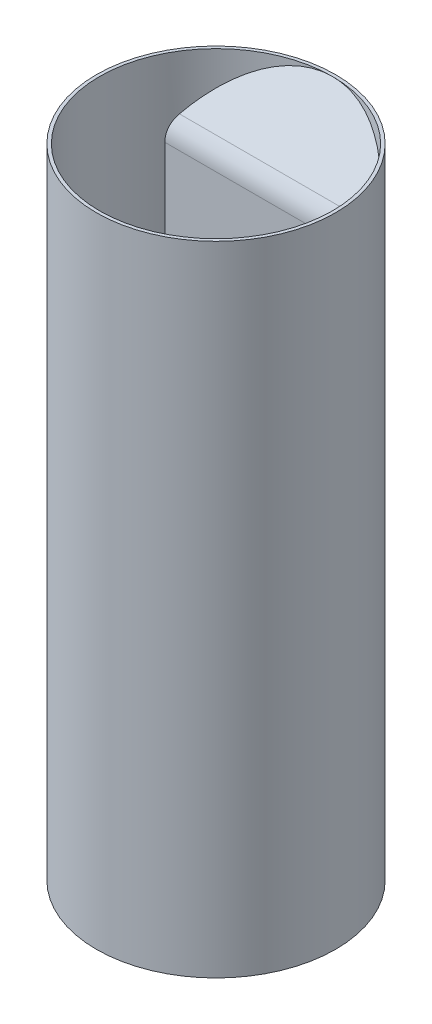
ISO-10303-21;
HEADER;
FILE_DESCRIPTION(('STEP AP214'),'2;1');
FILE_NAME('part.step','',(''),(''),'','','');
FILE_SCHEMA(('AUTOMOTIVE_DESIGN { 1 0 10303 214 1 1 1 1 }'));
ENDSEC;
DATA;
#1=APPLICATION_CONTEXT('core data for automotive mechanical design processes');
#2=APPLICATION_PROTOCOL_DEFINITION('international standard','automotive_design',2000,#1);
#3=PRODUCT_CONTEXT('',#1,'mechanical');
#4=PRODUCT('Part','Part','',(#3));
#5=PRODUCT_RELATED_PRODUCT_CATEGORY('part','',(#4));
#6=PRODUCT_DEFINITION_FORMATION('','',#4);
#7=PRODUCT_DEFINITION_CONTEXT('part definition',#1,'design');
#8=PRODUCT_DEFINITION('design','',#6,#7);
#9=PRODUCT_DEFINITION_SHAPE('','',#8);
#10=(LENGTH_UNIT() NAMED_UNIT(*) SI_UNIT(.MILLI.,.METRE.));
#11=(NAMED_UNIT(*) PLANE_ANGLE_UNIT() SI_UNIT($,.RADIAN.));
#12=(NAMED_UNIT(*) SI_UNIT($,.STERADIAN.) SOLID_ANGLE_UNIT());
#13=UNCERTAINTY_MEASURE_WITH_UNIT(LENGTH_MEASURE(1.E-05),#10,'distance_accuracy_value','');
#14=(GEOMETRIC_REPRESENTATION_CONTEXT(3) GLOBAL_UNCERTAINTY_ASSIGNED_CONTEXT((#13)) GLOBAL_UNIT_ASSIGNED_CONTEXT((#10,
#11,#12)) REPRESENTATION_CONTEXT('',''));
#15=CARTESIAN_POINT('',(0.,0.,0.));
#16=DIRECTION('',(0.,0.,1.));
#17=DIRECTION('',(1.,0.,0.));
#18=AXIS2_PLACEMENT_3D('',#15,#16,#17);
#19=CARTESIAN_POINT('',(0.,200.,0.));
#20=DIRECTION('',(0.,-1.,0.));
#21=DIRECTION('',(0.,0.,-1.));
#22=AXIS2_PLACEMENT_3D('',#19,#20,#21);
#23=CYLINDRICAL_SURFACE('',#22,37.5);
#24=CARTESIAN_POINT('',(0.,200.,0.));
#25=DIRECTION('',(0.,1.,0.));
#26=DIRECTION('',(0.,0.,1.));
#27=AXIS2_PLACEMENT_3D('',#24,#25,#26);
#28=CIRCLE('',#27,37.5);
#29=CARTESIAN_POINT('',(0.,200.,37.5));
#30=VERTEX_POINT('',#29);
#31=EDGE_CURVE('E124',#30,#30,#28,.T.);
#32=ORIENTED_EDGE('',*,*,#31,.F.);
#33=EDGE_LOOP('',(#32));
#34=FACE_BOUND('',#33,.T.);
#35=CARTESIAN_POINT('',(0.,0.,0.));
#36=DIRECTION('',(0.,1.,0.));
#37=DIRECTION('',(0.,0.,1.));
#38=AXIS2_PLACEMENT_3D('',#35,#36,#37);
#39=CIRCLE('',#38,37.5);
#40=CARTESIAN_POINT('',(0.,0.,37.5));
#41=VERTEX_POINT('',#40);
#42=EDGE_CURVE('E122',#41,#41,#39,.T.);
#43=ORIENTED_EDGE('',*,*,#42,.T.);
#44=EDGE_LOOP('',(#43));
#45=FACE_BOUND('',#44,.T.);
#46=ADVANCED_FACE('F50',(#34,#45),#23,.T.);
#47=CARTESIAN_POINT('',(0.,200.,0.));
#48=DIRECTION('',(0.,1.,0.));
#49=DIRECTION('',(0.,0.,1.));
#50=AXIS2_PLACEMENT_3D('',#47,#48,#49);
#51=PLANE('',#50);
#52=CARTESIAN_POINT('',(0.,200.,0.));
#53=DIRECTION('',(0.,1.,0.));
#54=DIRECTION('',(0.,0.,1.));
#55=AXIS2_PLACEMENT_3D('',#52,#53,#54);
#56=CIRCLE('',#55,36.5);
#57=CARTESIAN_POINT('',(0.,200.,-36.5));
#58=VERTEX_POINT('',#57);
#59=EDGE_CURVE('E117',#58,#58,#56,.T.);
#60=ORIENTED_EDGE('',*,*,#59,.F.);
#61=EDGE_LOOP('',(#60));
#62=FACE_BOUND('',#61,.T.);
#63=ORIENTED_EDGE('',*,*,#31,.T.);
#64=EDGE_LOOP('',(#63));
#65=FACE_BOUND('',#64,.T.);
#66=ADVANCED_FACE('F171',(#62,#65),#51,.T.);
#67=CARTESIAN_POINT('',(0.,0.,0.));
#68=DIRECTION('',(0.,1.,0.));
#69=DIRECTION('',(0.,0.,1.));
#70=AXIS2_PLACEMENT_3D('',#67,#68,#69);
#71=PLANE('',#70);
#72=CARTESIAN_POINT('',(0.,0.,0.));
#73=DIRECTION('',(0.,1.,0.));
#74=DIRECTION('',(0.,0.,1.));
#75=AXIS2_PLACEMENT_3D('',#72,#73,#74);
#76=CIRCLE('',#75,36.5);
#77=CARTESIAN_POINT('',(0.,0.,-36.5));
#78=VERTEX_POINT('',#77);
#79=EDGE_CURVE('E103',#78,#78,#76,.T.);
#80=ORIENTED_EDGE('',*,*,#79,.T.);
#81=EDGE_LOOP('',(#80));
#82=FACE_BOUND('',#81,.T.);
#83=ORIENTED_EDGE('',*,*,#42,.F.);
#84=EDGE_LOOP('',(#83));
#85=FACE_BOUND('',#84,.T.);
#86=ADVANCED_FACE('F114',(#82,#85),#71,.F.);
#87=CARTESIAN_POINT('',(0.,0.,-16.5));
#88=DIRECTION('',(0.,0.,-1.));
#89=DIRECTION('',(-1.,0.,0.));
#90=AXIS2_PLACEMENT_3D('',#87,#88,#89);
#91=PLANE('',#90);
#92=DIRECTION('',(0.,1.,0.));
#93=VECTOR('',#92,1.);
#94=CARTESIAN_POINT('',(-32.5576411921994,0.,-16.5));
#95=LINE('',#94,#93);
#96=CARTESIAN_POINT('',(-32.5576411921994,24.142135623731,-16.5));
#97=VERTEX_POINT('',#96);
#98=CARTESIAN_POINT('',(-32.5576411921994,175.857864376269,-16.5));
#99=VERTEX_POINT('',#98);
#100=EDGE_CURVE('E113',#97,#99,#95,.T.);
#101=ORIENTED_EDGE('',*,*,#100,.F.);
#102=DIRECTION('',(-1.,0.,0.));
#103=VECTOR('',#102,1.);
#104=CARTESIAN_POINT('',(32.5576411921994,24.142135623731,-16.5));
#105=LINE('',#104,#103);
#106=CARTESIAN_POINT('',(32.5576411921994,24.142135623731,-16.5));
#107=VERTEX_POINT('',#106);
#108=EDGE_CURVE('E140',#97,#107,#105,.F.);
#109=ORIENTED_EDGE('',*,*,#108,.T.);
#110=DIRECTION('',(0.,1.,0.));
#111=VECTOR('',#110,1.);
#112=CARTESIAN_POINT('',(32.5576411921994,0.,-16.5));
#113=LINE('',#112,#111);
#114=CARTESIAN_POINT('',(32.5576411921994,175.857864376269,-16.5));
#115=VERTEX_POINT('',#114);
#116=EDGE_CURVE('E118',#107,#115,#113,.T.);
#117=ORIENTED_EDGE('',*,*,#116,.T.);
#118=DIRECTION('',(-1.,0.,0.));
#119=VECTOR('',#118,1.);
#120=CARTESIAN_POINT('',(-32.5576411921994,175.857864376269,-16.5));
#121=LINE('',#120,#119);
#122=EDGE_CURVE('E134',#115,#99,#121,.T.);
#123=ORIENTED_EDGE('',*,*,#122,.T.);
#124=EDGE_LOOP('',(#101,#109,#117,#123));
#125=FACE_BOUND('',#124,.T.);
#126=ADVANCED_FACE('F178',(#125),#91,.F.);
#127=CARTESIAN_POINT('',(0.,0.,0.));
#128=DIRECTION('',(0.,1.,0.));
#129=DIRECTION('',(0.,0.,1.));
#130=AXIS2_PLACEMENT_3D('',#127,#128,#129);
#131=CYLINDRICAL_SURFACE('',#130,36.5);
#132=ORIENTED_EDGE('',*,*,#59,.T.);
#133=CARTESIAN_POINT('',(0.,163.5,0.));
#134=DIRECTION('',(0.,0.707106781186549,0.707106781186546));
#135=DIRECTION('',(0.,0.707106781186546,-0.707106781186549));
#136=AXIS2_PLACEMENT_3D('',#133,#134,#135);
#137=ELLIPSE('',#136,51.6187950266178,36.5);
#138=CARTESIAN_POINT('',(30.899297630025,182.928932188135,-19.4289321881345));
#139=VERTEX_POINT('',#138);
#140=EDGE_CURVE('E135',#58,#139,#137,.F.);
#141=ORIENTED_EDGE('',*,*,#140,.T.);
#142=CARTESIAN_POINT('',(30.899297630025,182.928932188135,-19.4289321881345));
#143=CARTESIAN_POINT('',(31.0075415299145,182.75685365177,-19.2568001959945));
#144=CARTESIAN_POINT('',(31.1107842388141,182.576830225323,-19.0893965583128));
#145=CARTESIAN_POINT('',(31.3070357989315,182.201626524123,-18.7657978255964));
#146=CARTESIAN_POINT('',(31.4000406640883,182.006440395933,-18.6096071044379));
#147=CARTESIAN_POINT('',(31.5756734478273,181.60138047178,-18.3100276776641));
#148=CARTESIAN_POINT('',(31.658280566387,181.39147850315,-18.1666647938027));
#149=CARTESIAN_POINT('',(31.8127167498647,180.958513494411,-17.894845154152));
#150=CARTESIAN_POINT('',(31.8845475675578,180.735452602854,-17.7663859750337));
#151=CARTESIAN_POINT('',(32.0175417261876,180.276812746571,-17.5255817254496));
#152=CARTESIAN_POINT('',(32.0786718426565,180.041197656195,-17.4132870291337));
#153=CARTESIAN_POINT('',(32.1899446642923,179.559699617599,-17.2067206587989));
#154=CARTESIAN_POINT('',(32.2400877822675,179.313817055567,-17.1124483076533));
#155=CARTESIAN_POINT('',(32.3292881257125,178.814109056346,-16.943324989152));
#156=CARTESIAN_POINT('',(32.3683690718635,178.560301930497,-16.8684324955235));
#157=CARTESIAN_POINT('',(32.4355959627582,178.046294994448,-16.7388005921279));
#158=CARTESIAN_POINT('',(32.4637462069337,177.786097740618,-16.6840532590011));
#159=CARTESIAN_POINT('',(32.5102005233276,177.249228519579,-16.593360315745));
#160=CARTESIAN_POINT('',(32.5279976789246,176.972345997163,-16.5583847471474));
#161=CARTESIAN_POINT('',(32.5457869955034,176.555307917509,-16.5233741618668));
#162=CARTESIAN_POINT('',(32.550232364911,176.416009820389,-16.514612761454));
#163=CARTESIAN_POINT('',(32.5561589073665,176.137103175065,-16.5029252373418));
#164=CARTESIAN_POINT('',(32.5576400178526,175.997494620371,-16.499999236801));
#165=CARTESIAN_POINT('',(32.5576411921994,175.857864376269,-16.5));
#166=B_SPLINE_CURVE_WITH_KNOTS('',3,(#142,#143,#144,#145,#146,#147,#148,#149,#150,#151,#152,
#153,#154,#155,#156,#157,#158,#159,#160,#161,#162,#163,#164,#165),.UNSPECIFIED.,.F.,.F.,(4,2,2,
2,2,2,2,2,2,2,2,4),(0.,0.798995803267654,1.5983015999962,2.39918176837233,3.19993153129935,
4.0031250560374,4.80628839765824,5.60771623395421,6.40882852023572,7.24643258734456,
7.6652327556995,8.08404176292168),.UNSPECIFIED.);
#167=EDGE_CURVE('E11',#139,#115,#166,.T.);
#168=ORIENTED_EDGE('',*,*,#167,.T.);
#169=ORIENTED_EDGE('',*,*,#116,.F.);
#170=CARTESIAN_POINT('',(32.5576411921994,24.142135623731,-16.5));
#171=CARTESIAN_POINT('',(32.5576389522576,23.8869255383999,-16.4999584924655));
#172=CARTESIAN_POINT('',(32.5526901166759,23.6317236395296,-16.5097680302682));
#173=CARTESIAN_POINT('',(32.5328831831432,23.1232257057136,-16.5487883264748));
#174=CARTESIAN_POINT('',(32.518026341862,22.8699294331898,-16.5779966244587));
#175=CARTESIAN_POINT('',(32.4784470770614,22.3678244802633,-16.6553968798009));
#176=CARTESIAN_POINT('',(32.4537545269733,22.1190045741792,-16.7035313481399));
#177=CARTESIAN_POINT('',(32.3944779807326,21.6268521809854,-16.8182039987498));
#178=CARTESIAN_POINT('',(32.3598941407941,21.3835196072793,-16.8847418903734));
#179=CARTESIAN_POINT('',(32.2808001371203,20.9039515122782,-17.0354680626747));
#180=CARTESIAN_POINT('',(32.2362865959857,20.6677184368385,-17.1196623482543));
#181=CARTESIAN_POINT('',(32.1373350649997,20.2040130415888,-17.3047016149108));
#182=CARTESIAN_POINT('',(32.0828967024371,19.9765410511764,-17.4055472212885));
#183=CARTESIAN_POINT('',(31.9641054681002,19.5317486909147,-17.6227486687487));
#184=CARTESIAN_POINT('',(31.8997501909239,19.3144308007089,-17.7391082719107));
#185=CARTESIAN_POINT('',(31.761234995621,18.8913489873374,-17.9859384751941));
#186=CARTESIAN_POINT('',(31.6870772096706,18.6855825654008,-18.1164060055338));
#187=CARTESIAN_POINT('',(31.5057464228802,18.2277828237302,-18.430401984429));
#188=CARTESIAN_POINT('',(31.3952820701677,17.9799694124595,-18.6182416024346));
#189=CARTESIAN_POINT('',(31.2178949746387,17.6257810143868,-18.9131218614135));
#190=CARTESIAN_POINT('',(31.1568817222092,17.5107422929543,-19.0134993790114));
#191=CARTESIAN_POINT('',(31.0309812601147,17.2865001202929,-19.2182897197835));
#192=CARTESIAN_POINT('',(30.9660936775293,17.1772972327105,-19.3227029310677));
#193=CARTESIAN_POINT('',(30.899297630025,17.0710678118655,-19.4289321881345));
#194=B_SPLINE_CURVE_WITH_KNOTS('',3,(#170,#171,#172,#173,#174,#175,#176,#177,#178,#179,#180,
#181,#182,#183,#184,#185,#186,#187,#188,#189,#190,#191,#192,#193),.UNSPECIFIED.,.F.,.F.,(4,2,2,
2,2,2,2,2,2,2,2,4),(0.,0.765381594915094,1.53066613205179,2.29364382454999,3.05660946793536,
3.81983501634967,4.583089232413,5.34652887222588,6.10980272617207,7.09785397267436,
7.59093313424206,8.0840598334737),.UNSPECIFIED.);
#195=CARTESIAN_POINT('',(30.899297630025,17.0710678118655,-19.4289321881345));
#196=VERTEX_POINT('',#195);
#197=EDGE_CURVE('E106',#107,#196,#194,.T.);
#198=ORIENTED_EDGE('',*,*,#197,.T.);
#199=CARTESIAN_POINT('',(0.,36.5000000000001,0.));
#200=DIRECTION('',(0.,0.707106781186546,-0.707106781186548));
#201=DIRECTION('',(0.,0.707106781186549,0.707106781186547));
#202=AXIS2_PLACEMENT_3D('',#199,#200,#201);
#203=ELLIPSE('',#202,51.618795026618,36.5);
#204=EDGE_CURVE('E98',#196,#78,#203,.T.);
#205=ORIENTED_EDGE('',*,*,#204,.T.);
#206=ORIENTED_EDGE('',*,*,#79,.F.);
#207=CARTESIAN_POINT('',(0.,36.5000000000001,0.));
#208=DIRECTION('',(0.,0.707106781186546,-0.707106781186548));
#209=DIRECTION('',(0.,0.707106781186549,0.707106781186547));
#210=AXIS2_PLACEMENT_3D('',#207,#208,#209);
#211=ELLIPSE('',#210,51.618795026618,36.5);
#212=CARTESIAN_POINT('',(-30.899297630025,17.0710678118655,-19.4289321881345));
#213=VERTEX_POINT('',#212);
#214=EDGE_CURVE('E109',#78,#213,#211,.T.);
#215=ORIENTED_EDGE('',*,*,#214,.T.);
#216=CARTESIAN_POINT('',(-30.899297630025,17.0710678118655,-19.4289321881345));
#217=CARTESIAN_POINT('',(-31.0075415299146,17.2431463482299,-19.2568001959945));
#218=CARTESIAN_POINT('',(-31.1107842388141,17.4231697746776,-19.0893965583128));
#219=CARTESIAN_POINT('',(-31.3070357989315,17.7983734758774,-18.7657978255964));
#220=CARTESIAN_POINT('',(-31.4000406640883,17.9935596040674,-18.6096071044379));
#221=CARTESIAN_POINT('',(-31.5756734478273,18.3986195282205,-18.3100276776641));
#222=CARTESIAN_POINT('',(-31.6582805663871,18.6085214968504,-18.1666647938027));
#223=CARTESIAN_POINT('',(-31.8127167498647,19.0414865055892,-17.894845154152));
#224=CARTESIAN_POINT('',(-31.8845475675578,19.2645473971465,-17.7663859750337));
#225=CARTESIAN_POINT('',(-32.0175417261876,19.7231872534289,-17.5255817254495));
#226=CARTESIAN_POINT('',(-32.0786718426565,19.9588023438051,-17.4132870291337));
#227=CARTESIAN_POINT('',(-32.1899446642923,20.4403003824007,-17.2067206587988));
#228=CARTESIAN_POINT('',(-32.2400877822675,20.6861829444327,-17.1124483076533));
#229=CARTESIAN_POINT('',(-32.3292881257125,21.185890943654,-16.943324989152));
#230=CARTESIAN_POINT('',(-32.3683690718635,21.4396980695029,-16.8684324955235));
#231=CARTESIAN_POINT('',(-32.4355959627581,21.9537050055516,-16.7388005921279));
#232=CARTESIAN_POINT('',(-32.4637462069337,22.2139022593822,-16.6840532590011));
#233=CARTESIAN_POINT('',(-32.5102005233276,22.7507714804207,-16.593360315745));
#234=CARTESIAN_POINT('',(-32.5279976789246,23.0276540028372,-16.5583847471474));
#235=CARTESIAN_POINT('',(-32.5457869955034,23.4446920824914,-16.5233741618668));
#236=CARTESIAN_POINT('',(-32.550232364911,23.5839901796108,-16.514612761454));
#237=CARTESIAN_POINT('',(-32.5561589073665,23.8628968249346,-16.5029252373418));
#238=CARTESIAN_POINT('',(-32.5576400178526,24.0025053796292,-16.499999236801));
#239=CARTESIAN_POINT('',(-32.5576411921994,24.142135623731,-16.5));
#240=B_SPLINE_CURVE_WITH_KNOTS('',3,(#216,#217,#218,#219,#220,#221,#222,#223,#224,#225,#226,
#227,#228,#229,#230,#231,#232,#233,#234,#235,#236,#237,#238,#239),.UNSPECIFIED.,.F.,.F.,(4,2,2,
2,2,2,2,2,2,2,2,4),(0.,0.798995803267645,1.59830159999621,2.39918176837234,3.19993153129935,
4.0031250560374,4.80628839765822,5.60771623395417,6.40882852023568,7.24643258734446,
7.66523275569939,8.08404176292164),.UNSPECIFIED.);
#241=EDGE_CURVE('E146',#213,#97,#240,.T.);
#242=ORIENTED_EDGE('',*,*,#241,.T.);
#243=ORIENTED_EDGE('',*,*,#100,.T.);
#244=CARTESIAN_POINT('',(-32.5576411921994,175.857864376269,-16.5));
#245=CARTESIAN_POINT('',(-32.5576389522576,176.1130744616,-16.4999584924655));
#246=CARTESIAN_POINT('',(-32.5526901166759,176.36827636047,-16.5097680302682));
#247=CARTESIAN_POINT('',(-32.5328831831432,176.876774294286,-16.5487883264748));
#248=CARTESIAN_POINT('',(-32.518026341862,177.13007056681,-16.5779966244587));
#249=CARTESIAN_POINT('',(-32.4784470770614,177.632175519737,-16.6553968798009));
#250=CARTESIAN_POINT('',(-32.4537545269733,177.880995425821,-16.7035313481399));
#251=CARTESIAN_POINT('',(-32.3944779807326,178.373147819015,-16.8182039987498));
#252=CARTESIAN_POINT('',(-32.3598941407941,178.616480392721,-16.8847418903734));
#253=CARTESIAN_POINT('',(-32.2808001371203,179.096048487722,-17.0354680626747));
#254=CARTESIAN_POINT('',(-32.2362865959857,179.332281563162,-17.1196623482543));
#255=CARTESIAN_POINT('',(-32.1373350649997,179.795986958411,-17.3047016149108));
#256=CARTESIAN_POINT('',(-32.0828967024371,180.023458948824,-17.4055472212885));
#257=CARTESIAN_POINT('',(-31.9641054681002,180.468251309085,-17.6227486687486));
#258=CARTESIAN_POINT('',(-31.8997501909239,180.685569199291,-17.7391082719107));
#259=CARTESIAN_POINT('',(-31.761234995621,181.108651012663,-17.9859384751941));
#260=CARTESIAN_POINT('',(-31.6870772096706,181.314417434599,-18.1164060055338));
#261=CARTESIAN_POINT('',(-31.5057464228802,181.77221717627,-18.430401984429));
#262=CARTESIAN_POINT('',(-31.3952820701677,182.020030587541,-18.6182416024346));
#263=CARTESIAN_POINT('',(-31.2178949746387,182.374218985613,-18.9131218614135));
#264=CARTESIAN_POINT('',(-31.1568817222092,182.489257707046,-19.0134993790114));
#265=CARTESIAN_POINT('',(-31.0309812601147,182.713499879707,-19.2182897197835));
#266=CARTESIAN_POINT('',(-30.9660936775293,182.82270276729,-19.3227029310677));
#267=CARTESIAN_POINT('',(-30.899297630025,182.928932188135,-19.4289321881345));
#268=B_SPLINE_CURVE_WITH_KNOTS('',3,(#244,#245,#246,#247,#248,#249,#250,#251,#252,#253,#254,
#255,#256,#257,#258,#259,#260,#261,#262,#263,#264,#265,#266,#267),.UNSPECIFIED.,.F.,.F.,(4,2,2,
2,2,2,2,2,2,2,2,4),(0.,0.765381594915073,1.53066613205178,2.29364382455002,3.05660946793534,
3.81983501634966,4.58308923241299,5.34652887222588,6.10980272617207,7.09785397267438,
7.59093313424209,8.08405983347376),.UNSPECIFIED.);
#269=CARTESIAN_POINT('',(-30.899297630025,182.928932188135,-19.4289321881345));
#270=VERTEX_POINT('',#269);
#271=EDGE_CURVE('E62',#99,#270,#268,.T.);
#272=ORIENTED_EDGE('',*,*,#271,.T.);
#273=CARTESIAN_POINT('',(0.,163.5,0.));
#274=DIRECTION('',(0.,0.707106781186549,0.707106781186546));
#275=DIRECTION('',(0.,0.707106781186546,-0.707106781186549));
#276=AXIS2_PLACEMENT_3D('',#273,#274,#275);
#277=ELLIPSE('',#276,51.6187950266178,36.5);
#278=EDGE_CURVE('E108',#270,#58,#277,.F.);
#279=ORIENTED_EDGE('',*,*,#278,.T.);
#280=EDGE_LOOP('',(#132,#141,#168,#169,#198,#205,#206,#215,#242,#243,#272,#279));
#281=FACE_BOUND('',#280,.T.);
#282=ADVANCED_FACE('F101',(#281),#131,.F.);
#283=CARTESIAN_POINT('',(0.,0.,-36.5));
#284=DIRECTION('',(0.,0.707106781186546,-0.707106781186548));
#285=DIRECTION('',(-1.,0.,0.));
#286=AXIS2_PLACEMENT_3D('',#283,#284,#285);
#287=PLANE('',#286);
#288=ORIENTED_EDGE('',*,*,#204,.F.);
#289=DIRECTION('',(1.,0.,0.));
#290=VECTOR('',#289,1.);
#291=CARTESIAN_POINT('',(-32.5576411921994,17.0710678118655,-19.4289321881345));
#292=LINE('',#291,#290);
#293=EDGE_CURVE('E139',#196,#213,#292,.F.);
#294=ORIENTED_EDGE('',*,*,#293,.T.);
#295=ORIENTED_EDGE('',*,*,#214,.F.);
#296=EDGE_LOOP('',(#288,#294,#295));
#297=FACE_BOUND('',#296,.T.);
#298=ADVANCED_FACE('F169',(#297),#287,.F.);
#299=CARTESIAN_POINT('',(0.,180.,-16.5));
#300=DIRECTION('',(0.,0.707106781186549,0.707106781186546));
#301=DIRECTION('',(1.,0.,0.));
#302=AXIS2_PLACEMENT_3D('',#299,#300,#301);
#303=PLANE('',#302);
#304=ORIENTED_EDGE('',*,*,#278,.F.);
#305=DIRECTION('',(-1.,0.,0.));
#306=VECTOR('',#305,1.);
#307=CARTESIAN_POINT('',(32.5576411921994,182.928932188135,-19.4289321881345));
#308=LINE('',#307,#306);
#309=EDGE_CURVE('E74',#270,#139,#308,.F.);
#310=ORIENTED_EDGE('',*,*,#309,.T.);
#311=ORIENTED_EDGE('',*,*,#140,.F.);
#312=EDGE_LOOP('',(#304,#310,#311));
#313=FACE_BOUND('',#312,.T.);
#314=ADVANCED_FACE('F157',(#313),#303,.T.);
#315=CARTESIAN_POINT('',(0.,24.142135623731,-26.5));
#316=DIRECTION('',(1.,0.,0.));
#317=DIRECTION('',(0.,0.,-1.));
#318=AXIS2_PLACEMENT_3D('',#315,#316,#317);
#319=CYLINDRICAL_SURFACE('',#318,10.);
#320=ORIENTED_EDGE('',*,*,#241,.F.);
#321=ORIENTED_EDGE('',*,*,#293,.F.);
#322=ORIENTED_EDGE('',*,*,#197,.F.);
#323=ORIENTED_EDGE('',*,*,#108,.F.);
#324=EDGE_LOOP('',(#320,#321,#322,#323));
#325=FACE_BOUND('',#324,.T.);
#326=ADVANCED_FACE('F154',(#325),#319,.T.);
#327=CARTESIAN_POINT('',(0.,175.857864376269,-26.5));
#328=DIRECTION('',(1.,0.,0.));
#329=DIRECTION('',(0.,0.,-1.));
#330=AXIS2_PLACEMENT_3D('',#327,#328,#329);
#331=CYLINDRICAL_SURFACE('',#330,10.);
#332=ORIENTED_EDGE('',*,*,#167,.F.);
#333=ORIENTED_EDGE('',*,*,#309,.F.);
#334=ORIENTED_EDGE('',*,*,#271,.F.);
#335=ORIENTED_EDGE('',*,*,#122,.F.);
#336=EDGE_LOOP('',(#332,#333,#334,#335));
#337=FACE_BOUND('',#336,.T.);
#338=ADVANCED_FACE('F47',(#337),#331,.T.);
#339=CLOSED_SHELL('',(#46,#66,#86,#126,#282,#298,#314,#326,#338));
#340=MANIFOLD_SOLID_BREP('B2',#339);
#341=ADVANCED_BREP_SHAPE_REPRESENTATION('',(#18,#340),#14);
#342=SHAPE_DEFINITION_REPRESENTATION(#9,#341);
ENDSEC;
END-ISO-10303-21;
